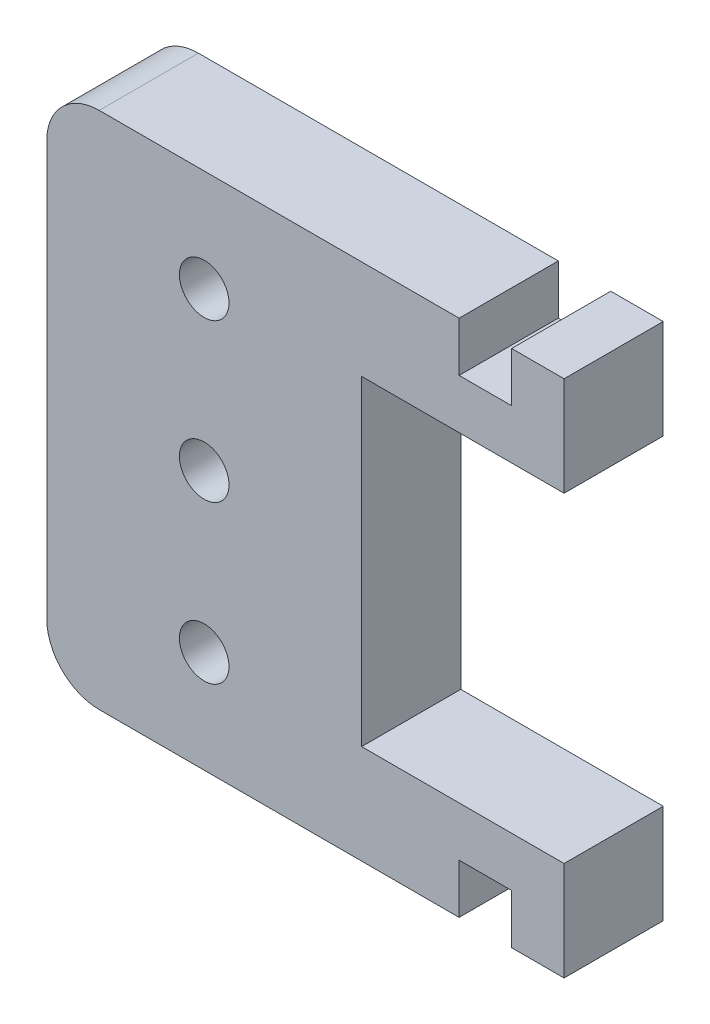
ISO-10303-21;
HEADER;
FILE_DESCRIPTION(('STEP AP214'),'2;1');
FILE_NAME('part.step','',(''),(''),'','','');
FILE_SCHEMA(('AUTOMOTIVE_DESIGN { 1 0 10303 214 1 1 1 1 }'));
ENDSEC;
DATA;
#1=APPLICATION_CONTEXT('core data for automotive mechanical design processes');
#2=APPLICATION_PROTOCOL_DEFINITION('international standard','automotive_design',2000,#1);
#3=PRODUCT_CONTEXT('',#1,'mechanical');
#4=PRODUCT('Part','Part','',(#3));
#5=PRODUCT_RELATED_PRODUCT_CATEGORY('part','',(#4));
#6=PRODUCT_DEFINITION_FORMATION('','',#4);
#7=PRODUCT_DEFINITION_CONTEXT('part definition',#1,'design');
#8=PRODUCT_DEFINITION('design','',#6,#7);
#9=PRODUCT_DEFINITION_SHAPE('','',#8);
#10=(LENGTH_UNIT() NAMED_UNIT(*) SI_UNIT(.MILLI.,.METRE.));
#11=(NAMED_UNIT(*) PLANE_ANGLE_UNIT() SI_UNIT($,.RADIAN.));
#12=(NAMED_UNIT(*) SI_UNIT($,.STERADIAN.) SOLID_ANGLE_UNIT());
#13=UNCERTAINTY_MEASURE_WITH_UNIT(LENGTH_MEASURE(1.E-05),#10,'distance_accuracy_value','');
#14=(GEOMETRIC_REPRESENTATION_CONTEXT(3) GLOBAL_UNCERTAINTY_ASSIGNED_CONTEXT((#13)) GLOBAL_UNIT_ASSIGNED_CONTEXT((#10,
#11,#12)) REPRESENTATION_CONTEXT('',''));
#15=CARTESIAN_POINT('',(0.,0.,0.));
#16=DIRECTION('',(0.,0.,1.));
#17=DIRECTION('',(1.,0.,0.));
#18=AXIS2_PLACEMENT_3D('',#15,#16,#17);
#19=CARTESIAN_POINT('',(0.,-15.699999969,3.));
#20=DIRECTION('',(0.,1.,0.));
#21=DIRECTION('',(0.,0.,1.));
#22=AXIS2_PLACEMENT_3D('',#19,#20,#21);
#23=PLANE('',#22);
#24=DIRECTION('',(1.,0.,0.));
#25=VECTOR('',#24,1.);
#26=CARTESIAN_POINT('',(0.,-15.699999969,3.));
#27=LINE('',#26,#25);
#28=CARTESIAN_POINT('',(-6.35000000000001,-15.699999969,3.));
#29=VERTEX_POINT('',#28);
#30=CARTESIAN_POINT('',(15.425,-15.699999969,3.));
#31=VERTEX_POINT('',#30);
#32=EDGE_CURVE('E174',#29,#31,#27,.T.);
#33=ORIENTED_EDGE('',*,*,#32,.F.);
#34=DIRECTION('',(0.,0.,-1.));
#35=VECTOR('',#34,1.);
#36=CARTESIAN_POINT('',(-6.35000000000001,-15.699999969,-3.));
#37=LINE('',#36,#35);
#38=CARTESIAN_POINT('',(-6.35000000000001,-15.699999969,-3.));
#39=VERTEX_POINT('',#38);
#40=EDGE_CURVE('E201',#29,#39,#37,.T.);
#41=ORIENTED_EDGE('',*,*,#40,.T.);
#42=DIRECTION('',(1.,0.,0.));
#43=VECTOR('',#42,1.);
#44=CARTESIAN_POINT('',(0.,-15.699999969,-3.));
#45=LINE('',#44,#43);
#46=CARTESIAN_POINT('',(15.425,-15.699999969,-3.));
#47=VERTEX_POINT('',#46);
#48=EDGE_CURVE('E198',#39,#47,#45,.T.);
#49=ORIENTED_EDGE('',*,*,#48,.T.);
#50=DIRECTION('',(0.,0.,-1.));
#51=VECTOR('',#50,1.);
#52=CARTESIAN_POINT('',(15.425,-15.699999969,3.));
#53=LINE('',#52,#51);
#54=EDGE_CURVE('E190',#31,#47,#53,.T.);
#55=ORIENTED_EDGE('',*,*,#54,.F.);
#56=EDGE_LOOP('',(#33,#41,#49,#55));
#57=FACE_BOUND('',#56,.T.);
#58=ADVANCED_FACE('F50',(#57),#23,.F.);
#59=CARTESIAN_POINT('',(15.425,0.,3.));
#60=DIRECTION('',(-1.,0.,0.));
#61=DIRECTION('',(0.,-1.,0.));
#62=AXIS2_PLACEMENT_3D('',#59,#60,#61);
#63=PLANE('',#62);
#64=DIRECTION('',(0.,1.,0.));
#65=VECTOR('',#64,1.);
#66=CARTESIAN_POINT('',(15.425,0.,-3.));
#67=LINE('',#66,#65);
#68=CARTESIAN_POINT('',(15.425,-12.699999969,-3.));
#69=VERTEX_POINT('',#68);
#70=EDGE_CURVE('E310',#47,#69,#67,.T.);
#71=ORIENTED_EDGE('',*,*,#70,.T.);
#72=DIRECTION('',(0.,0.,-1.));
#73=VECTOR('',#72,1.);
#74=CARTESIAN_POINT('',(15.425,-12.699999969,3.));
#75=LINE('',#74,#73);
#76=CARTESIAN_POINT('',(15.425,-12.699999969,3.));
#77=VERTEX_POINT('',#76);
#78=EDGE_CURVE('E192',#77,#69,#75,.T.);
#79=ORIENTED_EDGE('',*,*,#78,.F.);
#80=DIRECTION('',(0.,1.,0.));
#81=VECTOR('',#80,1.);
#82=CARTESIAN_POINT('',(15.425,0.,3.));
#83=LINE('',#82,#81);
#84=EDGE_CURVE('E177',#31,#77,#83,.T.);
#85=ORIENTED_EDGE('',*,*,#84,.F.);
#86=ORIENTED_EDGE('',*,*,#54,.T.);
#87=EDGE_LOOP('',(#71,#79,#85,#86));
#88=FACE_BOUND('',#87,.T.);
#89=ADVANCED_FACE('F189',(#88),#63,.F.);
#90=CARTESIAN_POINT('',(0.,-12.699999969,3.));
#91=DIRECTION('',(0.,1.,0.));
#92=DIRECTION('',(0.,0.,1.));
#93=AXIS2_PLACEMENT_3D('',#90,#91,#92);
#94=PLANE('',#93);
#95=DIRECTION('',(1.,0.,0.));
#96=VECTOR('',#95,1.);
#97=CARTESIAN_POINT('',(0.,-12.699999969,-3.));
#98=LINE('',#97,#96);
#99=CARTESIAN_POINT('',(18.6,-12.699999969,-3.));
#100=VERTEX_POINT('',#99);
#101=EDGE_CURVE('E313',#69,#100,#98,.T.);
#102=ORIENTED_EDGE('',*,*,#101,.T.);
#103=DIRECTION('',(0.,0.,-1.));
#104=VECTOR('',#103,1.);
#105=CARTESIAN_POINT('',(18.6,-12.699999969,3.));
#106=LINE('',#105,#104);
#107=CARTESIAN_POINT('',(18.6,-12.699999969,3.));
#108=VERTEX_POINT('',#107);
#109=EDGE_CURVE('E207',#108,#100,#106,.T.);
#110=ORIENTED_EDGE('',*,*,#109,.F.);
#111=DIRECTION('',(1.,0.,0.));
#112=VECTOR('',#111,1.);
#113=CARTESIAN_POINT('',(0.,-12.699999969,3.));
#114=LINE('',#113,#112);
#115=EDGE_CURVE('E195',#77,#108,#114,.T.);
#116=ORIENTED_EDGE('',*,*,#115,.F.);
#117=ORIENTED_EDGE('',*,*,#78,.T.);
#118=EDGE_LOOP('',(#102,#110,#116,#117));
#119=FACE_BOUND('',#118,.T.);
#120=ADVANCED_FACE('F502',(#119),#94,.F.);
#121=CARTESIAN_POINT('',(18.6,0.,3.));
#122=DIRECTION('',(1.,0.,0.));
#123=DIRECTION('',(0.,0.,-1.));
#124=AXIS2_PLACEMENT_3D('',#121,#122,#123);
#125=PLANE('',#124);
#126=DIRECTION('',(0.,-1.,0.));
#127=VECTOR('',#126,1.);
#128=CARTESIAN_POINT('',(18.6,0.,-3.));
#129=LINE('',#128,#127);
#130=CARTESIAN_POINT('',(18.6,-15.699999969,-3.));
#131=VERTEX_POINT('',#130);
#132=EDGE_CURVE('E316',#100,#131,#129,.T.);
#133=ORIENTED_EDGE('',*,*,#132,.T.);
#134=DIRECTION('',(0.,0.,-1.));
#135=VECTOR('',#134,1.);
#136=CARTESIAN_POINT('',(18.6,-15.699999969,3.));
#137=LINE('',#136,#135);
#138=CARTESIAN_POINT('',(18.6,-15.699999969,3.));
#139=VERTEX_POINT('',#138);
#140=EDGE_CURVE('E396',#139,#131,#137,.T.);
#141=ORIENTED_EDGE('',*,*,#140,.F.);
#142=DIRECTION('',(0.,-1.,0.));
#143=VECTOR('',#142,1.);
#144=CARTESIAN_POINT('',(18.6,0.,3.));
#145=LINE('',#144,#143);
#146=EDGE_CURVE('E243',#108,#139,#145,.T.);
#147=ORIENTED_EDGE('',*,*,#146,.F.);
#148=ORIENTED_EDGE('',*,*,#109,.T.);
#149=EDGE_LOOP('',(#133,#141,#147,#148));
#150=FACE_BOUND('',#149,.T.);
#151=ADVANCED_FACE('F404',(#150),#125,.F.);
#152=CARTESIAN_POINT('',(0.,-15.699999969,3.));
#153=DIRECTION('',(0.,-1.,0.));
#154=DIRECTION('',(0.,0.,-1.));
#155=AXIS2_PLACEMENT_3D('',#152,#153,#154);
#156=PLANE('',#155);
#157=DIRECTION('',(-1.,0.,0.));
#158=VECTOR('',#157,1.);
#159=CARTESIAN_POINT('',(0.,-15.699999969,-3.));
#160=LINE('',#159,#158);
#161=CARTESIAN_POINT('',(21.775,-15.699999969,-3.));
#162=VERTEX_POINT('',#161);
#163=EDGE_CURVE('E320',#162,#131,#160,.T.);
#164=ORIENTED_EDGE('',*,*,#163,.F.);
#165=DIRECTION('',(0.,0.,-1.));
#166=VECTOR('',#165,1.);
#167=CARTESIAN_POINT('',(21.775,-15.699999969,3.));
#168=LINE('',#167,#166);
#169=CARTESIAN_POINT('',(21.775,-15.699999969,3.));
#170=VERTEX_POINT('',#169);
#171=EDGE_CURVE('E393',#170,#162,#168,.T.);
#172=ORIENTED_EDGE('',*,*,#171,.F.);
#173=DIRECTION('',(-1.,0.,0.));
#174=VECTOR('',#173,1.);
#175=CARTESIAN_POINT('',(0.,-15.699999969,3.));
#176=LINE('',#175,#174);
#177=EDGE_CURVE('E251',#170,#139,#176,.T.);
#178=ORIENTED_EDGE('',*,*,#177,.T.);
#179=ORIENTED_EDGE('',*,*,#140,.T.);
#180=EDGE_LOOP('',(#164,#172,#178,#179));
#181=FACE_BOUND('',#180,.T.);
#182=ADVANCED_FACE('F414',(#181),#156,.T.);
#183=CARTESIAN_POINT('',(21.775,0.,3.));
#184=DIRECTION('',(1.,0.,0.));
#185=DIRECTION('',(0.,1.,0.));
#186=AXIS2_PLACEMENT_3D('',#183,#184,#185);
#187=PLANE('',#186);
#188=DIRECTION('',(0.,-1.,0.));
#189=VECTOR('',#188,1.);
#190=CARTESIAN_POINT('',(21.775,0.,-3.));
#191=LINE('',#190,#189);
#192=CARTESIAN_POINT('',(21.775,-9.699999969,-3.));
#193=VERTEX_POINT('',#192);
#194=EDGE_CURVE('E324',#193,#162,#191,.T.);
#195=ORIENTED_EDGE('',*,*,#194,.F.);
#196=DIRECTION('',(0.,0.,-1.));
#197=VECTOR('',#196,1.);
#198=CARTESIAN_POINT('',(21.775,-9.699999969,3.));
#199=LINE('',#198,#197);
#200=CARTESIAN_POINT('',(21.775,-9.699999969,3.));
#201=VERTEX_POINT('',#200);
#202=EDGE_CURVE('E390',#201,#193,#199,.T.);
#203=ORIENTED_EDGE('',*,*,#202,.F.);
#204=DIRECTION('',(0.,-1.,0.));
#205=VECTOR('',#204,1.);
#206=CARTESIAN_POINT('',(21.775,0.,3.));
#207=LINE('',#206,#205);
#208=EDGE_CURVE('E255',#201,#170,#207,.T.);
#209=ORIENTED_EDGE('',*,*,#208,.T.);
#210=ORIENTED_EDGE('',*,*,#171,.T.);
#211=EDGE_LOOP('',(#195,#203,#209,#210));
#212=FACE_BOUND('',#211,.T.);
#213=ADVANCED_FACE('F418',(#212),#187,.T.);
#214=CARTESIAN_POINT('',(0.,-9.699999969,3.));
#215=DIRECTION('',(0.,-1.,0.));
#216=DIRECTION('',(1.,0.,0.));
#217=AXIS2_PLACEMENT_3D('',#214,#215,#216);
#218=PLANE('',#217);
#219=DIRECTION('',(-1.,0.,0.));
#220=VECTOR('',#219,1.);
#221=CARTESIAN_POINT('',(0.,-9.699999969,-3.));
#222=LINE('',#221,#220);
#223=CARTESIAN_POINT('',(9.525,-9.699999969,-3.));
#224=VERTEX_POINT('',#223);
#225=EDGE_CURVE('E328',#193,#224,#222,.T.);
#226=ORIENTED_EDGE('',*,*,#225,.T.);
#227=DIRECTION('',(0.,0.,-1.));
#228=VECTOR('',#227,1.);
#229=CARTESIAN_POINT('',(9.525,-9.699999969,3.));
#230=LINE('',#229,#228);
#231=CARTESIAN_POINT('',(9.525,-9.699999969,3.));
#232=VERTEX_POINT('',#231);
#233=EDGE_CURVE('E386',#232,#224,#230,.T.);
#234=ORIENTED_EDGE('',*,*,#233,.F.);
#235=DIRECTION('',(-1.,0.,0.));
#236=VECTOR('',#235,1.);
#237=CARTESIAN_POINT('',(0.,-9.699999969,3.));
#238=LINE('',#237,#236);
#239=EDGE_CURVE('E260',#201,#232,#238,.T.);
#240=ORIENTED_EDGE('',*,*,#239,.F.);
#241=ORIENTED_EDGE('',*,*,#202,.T.);
#242=EDGE_LOOP('',(#226,#234,#240,#241));
#243=FACE_BOUND('',#242,.T.);
#244=ADVANCED_FACE('F422',(#243),#218,.F.);
#245=CARTESIAN_POINT('',(9.525,0.,3.));
#246=DIRECTION('',(-1.,0.,0.));
#247=DIRECTION('',(0.,0.,1.));
#248=AXIS2_PLACEMENT_3D('',#245,#246,#247);
#249=PLANE('',#248);
#250=DIRECTION('',(0.,1.,0.));
#251=VECTOR('',#250,1.);
#252=CARTESIAN_POINT('',(9.525,0.,-3.));
#253=LINE('',#252,#251);
#254=CARTESIAN_POINT('',(9.525,9.69999996899999,-3.));
#255=VERTEX_POINT('',#254);
#256=EDGE_CURVE('E331',#224,#255,#253,.T.);
#257=ORIENTED_EDGE('',*,*,#256,.T.);
#258=DIRECTION('',(0.,0.,-1.));
#259=VECTOR('',#258,1.);
#260=CARTESIAN_POINT('',(9.525,9.69999996899999,3.));
#261=LINE('',#260,#259);
#262=CARTESIAN_POINT('',(9.525,9.69999996899999,3.));
#263=VERTEX_POINT('',#262);
#264=EDGE_CURVE('E383',#263,#255,#261,.T.);
#265=ORIENTED_EDGE('',*,*,#264,.F.);
#266=DIRECTION('',(0.,1.,0.));
#267=VECTOR('',#266,1.);
#268=CARTESIAN_POINT('',(9.525,0.,3.));
#269=LINE('',#268,#267);
#270=EDGE_CURVE('E264',#232,#263,#269,.T.);
#271=ORIENTED_EDGE('',*,*,#270,.F.);
#272=ORIENTED_EDGE('',*,*,#233,.T.);
#273=EDGE_LOOP('',(#257,#265,#271,#272));
#274=FACE_BOUND('',#273,.T.);
#275=ADVANCED_FACE('F428',(#274),#249,.F.);
#276=CARTESIAN_POINT('',(0.,9.69999996899999,3.));
#277=DIRECTION('',(0.,-1.,0.));
#278=DIRECTION('',(1.,0.,0.));
#279=AXIS2_PLACEMENT_3D('',#276,#277,#278);
#280=PLANE('',#279);
#281=DIRECTION('',(-1.,0.,0.));
#282=VECTOR('',#281,1.);
#283=CARTESIAN_POINT('',(0.,9.69999996899999,-3.));
#284=LINE('',#283,#282);
#285=CARTESIAN_POINT('',(21.775,9.69999996899999,-3.));
#286=VERTEX_POINT('',#285);
#287=EDGE_CURVE('E335',#286,#255,#284,.T.);
#288=ORIENTED_EDGE('',*,*,#287,.F.);
#289=DIRECTION('',(0.,0.,-1.));
#290=VECTOR('',#289,1.);
#291=CARTESIAN_POINT('',(21.775,9.69999996899999,3.));
#292=LINE('',#291,#290);
#293=CARTESIAN_POINT('',(21.775,9.69999996899999,3.));
#294=VERTEX_POINT('',#293);
#295=EDGE_CURVE('E380',#294,#286,#292,.T.);
#296=ORIENTED_EDGE('',*,*,#295,.F.);
#297=DIRECTION('',(-1.,0.,0.));
#298=VECTOR('',#297,1.);
#299=CARTESIAN_POINT('',(0.,9.69999996899999,3.));
#300=LINE('',#299,#298);
#301=EDGE_CURVE('E272',#294,#263,#300,.T.);
#302=ORIENTED_EDGE('',*,*,#301,.T.);
#303=ORIENTED_EDGE('',*,*,#264,.T.);
#304=EDGE_LOOP('',(#288,#296,#302,#303));
#305=FACE_BOUND('',#304,.T.);
#306=ADVANCED_FACE('F432',(#305),#280,.T.);
#307=CARTESIAN_POINT('',(21.775,0.,3.));
#308=DIRECTION('',(-1.,0.,0.));
#309=DIRECTION('',(0.,-1.,0.));
#310=AXIS2_PLACEMENT_3D('',#307,#308,#309);
#311=PLANE('',#310);
#312=DIRECTION('',(0.,1.,0.));
#313=VECTOR('',#312,1.);
#314=CARTESIAN_POINT('',(21.775,0.,-3.));
#315=LINE('',#314,#313);
#316=CARTESIAN_POINT('',(21.775,15.699999969,-3.));
#317=VERTEX_POINT('',#316);
#318=EDGE_CURVE('E339',#286,#317,#315,.T.);
#319=ORIENTED_EDGE('',*,*,#318,.T.);
#320=DIRECTION('',(0.,0.,-1.));
#321=VECTOR('',#320,1.);
#322=CARTESIAN_POINT('',(21.775,15.699999969,3.));
#323=LINE('',#322,#321);
#324=CARTESIAN_POINT('',(21.775,15.699999969,3.));
#325=VERTEX_POINT('',#324);
#326=EDGE_CURVE('E376',#325,#317,#323,.T.);
#327=ORIENTED_EDGE('',*,*,#326,.F.);
#328=DIRECTION('',(0.,1.,0.));
#329=VECTOR('',#328,1.);
#330=CARTESIAN_POINT('',(21.775,0.,3.));
#331=LINE('',#330,#329);
#332=EDGE_CURVE('E276',#294,#325,#331,.T.);
#333=ORIENTED_EDGE('',*,*,#332,.F.);
#334=ORIENTED_EDGE('',*,*,#295,.T.);
#335=EDGE_LOOP('',(#319,#327,#333,#334));
#336=FACE_BOUND('',#335,.T.);
#337=ADVANCED_FACE('F437',(#336),#311,.F.);
#338=CARTESIAN_POINT('',(0.,15.699999969,3.));
#339=DIRECTION('',(0.,-1.,0.));
#340=DIRECTION('',(0.,0.,-1.));
#341=AXIS2_PLACEMENT_3D('',#338,#339,#340);
#342=PLANE('',#341);
#343=DIRECTION('',(-1.,0.,0.));
#344=VECTOR('',#343,1.);
#345=CARTESIAN_POINT('',(0.,15.699999969,-3.));
#346=LINE('',#345,#344);
#347=CARTESIAN_POINT('',(18.6,15.699999969,-3.));
#348=VERTEX_POINT('',#347);
#349=EDGE_CURVE('E342',#317,#348,#346,.T.);
#350=ORIENTED_EDGE('',*,*,#349,.T.);
#351=DIRECTION('',(0.,0.,-1.));
#352=VECTOR('',#351,1.);
#353=CARTESIAN_POINT('',(18.6,15.699999969,3.));
#354=LINE('',#353,#352);
#355=CARTESIAN_POINT('',(18.6,15.699999969,3.));
#356=VERTEX_POINT('',#355);
#357=EDGE_CURVE('E373',#356,#348,#354,.T.);
#358=ORIENTED_EDGE('',*,*,#357,.F.);
#359=DIRECTION('',(-1.,0.,0.));
#360=VECTOR('',#359,1.);
#361=CARTESIAN_POINT('',(0.,15.699999969,3.));
#362=LINE('',#361,#360);
#363=EDGE_CURVE('E280',#325,#356,#362,.T.);
#364=ORIENTED_EDGE('',*,*,#363,.F.);
#365=ORIENTED_EDGE('',*,*,#326,.T.);
#366=EDGE_LOOP('',(#350,#358,#364,#365));
#367=FACE_BOUND('',#366,.T.);
#368=ADVANCED_FACE('F444',(#367),#342,.F.);
#369=CARTESIAN_POINT('',(18.6,0.,3.));
#370=DIRECTION('',(-1.,0.,0.));
#371=DIRECTION('',(0.,0.,1.));
#372=AXIS2_PLACEMENT_3D('',#369,#370,#371);
#373=PLANE('',#372);
#374=DIRECTION('',(0.,1.,0.));
#375=VECTOR('',#374,1.);
#376=CARTESIAN_POINT('',(18.6,0.,-3.));
#377=LINE('',#376,#375);
#378=CARTESIAN_POINT('',(18.6,12.699999969,-3.));
#379=VERTEX_POINT('',#378);
#380=EDGE_CURVE('E346',#379,#348,#377,.T.);
#381=ORIENTED_EDGE('',*,*,#380,.F.);
#382=DIRECTION('',(0.,0.,-1.));
#383=VECTOR('',#382,1.);
#384=CARTESIAN_POINT('',(18.6,12.699999969,3.));
#385=LINE('',#384,#383);
#386=CARTESIAN_POINT('',(18.6,12.699999969,3.));
#387=VERTEX_POINT('',#386);
#388=EDGE_CURVE('E370',#387,#379,#385,.T.);
#389=ORIENTED_EDGE('',*,*,#388,.F.);
#390=DIRECTION('',(0.,1.,0.));
#391=VECTOR('',#390,1.);
#392=CARTESIAN_POINT('',(18.6,0.,3.));
#393=LINE('',#392,#391);
#394=EDGE_CURVE('E284',#387,#356,#393,.T.);
#395=ORIENTED_EDGE('',*,*,#394,.T.);
#396=ORIENTED_EDGE('',*,*,#357,.T.);
#397=EDGE_LOOP('',(#381,#389,#395,#396));
#398=FACE_BOUND('',#397,.T.);
#399=ADVANCED_FACE('F448',(#398),#373,.T.);
#400=CARTESIAN_POINT('',(0.,12.699999969,3.));
#401=DIRECTION('',(0.,1.,0.));
#402=DIRECTION('',(-1.,0.,0.));
#403=AXIS2_PLACEMENT_3D('',#400,#401,#402);
#404=PLANE('',#403);
#405=DIRECTION('',(1.,0.,0.));
#406=VECTOR('',#405,1.);
#407=CARTESIAN_POINT('',(0.,12.699999969,-3.));
#408=LINE('',#407,#406);
#409=CARTESIAN_POINT('',(15.425,12.699999969,-3.));
#410=VERTEX_POINT('',#409);
#411=EDGE_CURVE('E350',#410,#379,#408,.T.);
#412=ORIENTED_EDGE('',*,*,#411,.F.);
#413=DIRECTION('',(0.,0.,-1.));
#414=VECTOR('',#413,1.);
#415=CARTESIAN_POINT('',(15.425,12.699999969,3.));
#416=LINE('',#415,#414);
#417=CARTESIAN_POINT('',(15.425,12.699999969,3.));
#418=VERTEX_POINT('',#417);
#419=EDGE_CURVE('E367',#418,#410,#416,.T.);
#420=ORIENTED_EDGE('',*,*,#419,.F.);
#421=DIRECTION('',(1.,0.,0.));
#422=VECTOR('',#421,1.);
#423=CARTESIAN_POINT('',(0.,12.699999969,3.));
#424=LINE('',#423,#422);
#425=EDGE_CURVE('E291',#418,#387,#424,.T.);
#426=ORIENTED_EDGE('',*,*,#425,.T.);
#427=ORIENTED_EDGE('',*,*,#388,.T.);
#428=EDGE_LOOP('',(#412,#420,#426,#427));
#429=FACE_BOUND('',#428,.T.);
#430=ADVANCED_FACE('F536',(#429),#404,.T.);
#431=CARTESIAN_POINT('',(15.425,0.,3.));
#432=DIRECTION('',(1.,0.,0.));
#433=DIRECTION('',(0.,1.,0.));
#434=AXIS2_PLACEMENT_3D('',#431,#432,#433);
#435=PLANE('',#434);
#436=DIRECTION('',(0.,-1.,0.));
#437=VECTOR('',#436,1.);
#438=CARTESIAN_POINT('',(15.425,0.,-3.));
#439=LINE('',#438,#437);
#440=CARTESIAN_POINT('',(15.425,15.699999969,-3.));
#441=VERTEX_POINT('',#440);
#442=EDGE_CURVE('E354',#441,#410,#439,.T.);
#443=ORIENTED_EDGE('',*,*,#442,.F.);
#444=DIRECTION('',(0.,0.,-1.));
#445=VECTOR('',#444,1.);
#446=CARTESIAN_POINT('',(15.425,15.699999969,3.));
#447=LINE('',#446,#445);
#448=CARTESIAN_POINT('',(15.425,15.699999969,3.));
#449=VERTEX_POINT('',#448);
#450=EDGE_CURVE('E307',#449,#441,#447,.T.);
#451=ORIENTED_EDGE('',*,*,#450,.F.);
#452=DIRECTION('',(0.,-1.,0.));
#453=VECTOR('',#452,1.);
#454=CARTESIAN_POINT('',(15.425,0.,3.));
#455=LINE('',#454,#453);
#456=EDGE_CURVE('E295',#449,#418,#455,.T.);
#457=ORIENTED_EDGE('',*,*,#456,.T.);
#458=ORIENTED_EDGE('',*,*,#419,.T.);
#459=EDGE_LOOP('',(#443,#451,#457,#458));
#460=FACE_BOUND('',#459,.T.);
#461=ADVANCED_FACE('F539',(#460),#435,.T.);
#462=CARTESIAN_POINT('',(0.,15.699999969,3.));
#463=DIRECTION('',(0.,1.,0.));
#464=DIRECTION('',(0.,0.,1.));
#465=AXIS2_PLACEMENT_3D('',#462,#463,#464);
#466=PLANE('',#465);
#467=DIRECTION('',(1.,0.,0.));
#468=VECTOR('',#467,1.);
#469=CARTESIAN_POINT('',(0.,15.699999969,-3.));
#470=LINE('',#469,#468);
#471=CARTESIAN_POINT('',(-6.35000000000001,15.699999969,-3.));
#472=VERTEX_POINT('',#471);
#473=EDGE_CURVE('E358',#472,#441,#470,.T.);
#474=ORIENTED_EDGE('',*,*,#473,.F.);
#475=DIRECTION('',(0.,0.,-1.));
#476=VECTOR('',#475,1.);
#477=CARTESIAN_POINT('',(-6.35000000000001,15.699999969,3.));
#478=LINE('',#477,#476);
#479=CARTESIAN_POINT('',(-6.35000000000001,15.699999969,3.));
#480=VERTEX_POINT('',#479);
#481=EDGE_CURVE('E12',#472,#480,#478,.F.);
#482=ORIENTED_EDGE('',*,*,#481,.T.);
#483=DIRECTION('',(1.,0.,0.));
#484=VECTOR('',#483,1.);
#485=CARTESIAN_POINT('',(0.,15.699999969,3.));
#486=LINE('',#485,#484);
#487=EDGE_CURVE('E300',#480,#449,#486,.T.);
#488=ORIENTED_EDGE('',*,*,#487,.T.);
#489=ORIENTED_EDGE('',*,*,#450,.T.);
#490=EDGE_LOOP('',(#474,#482,#488,#489));
#491=FACE_BOUND('',#490,.T.);
#492=ADVANCED_FACE('F542',(#491),#466,.T.);
#493=CARTESIAN_POINT('',(-9.52500000000001,0.,3.));
#494=DIRECTION('',(-1.,0.,0.));
#495=DIRECTION('',(0.,0.,1.));
#496=AXIS2_PLACEMENT_3D('',#493,#494,#495);
#497=PLANE('',#496);
#498=DIRECTION('',(0.,1.,0.));
#499=VECTOR('',#498,1.);
#500=CARTESIAN_POINT('',(-9.52500000000001,0.,-3.));
#501=LINE('',#500,#499);
#502=CARTESIAN_POINT('',(-9.52500000000001,-12.524999969,-3.));
#503=VERTEX_POINT('',#502);
#504=CARTESIAN_POINT('',(-9.52500000000001,12.524999969,-3.));
#505=VERTEX_POINT('',#504);
#506=EDGE_CURVE('E185',#503,#505,#501,.T.);
#507=ORIENTED_EDGE('',*,*,#506,.F.);
#508=DIRECTION('',(0.,0.,-1.));
#509=VECTOR('',#508,1.);
#510=CARTESIAN_POINT('',(-9.52500000000001,-12.524999969,3.));
#511=LINE('',#510,#509);
#512=CARTESIAN_POINT('',(-9.52500000000001,-12.524999969,3.));
#513=VERTEX_POINT('',#512);
#514=EDGE_CURVE('E220',#503,#513,#511,.F.);
#515=ORIENTED_EDGE('',*,*,#514,.T.);
#516=DIRECTION('',(0.,1.,0.));
#517=VECTOR('',#516,1.);
#518=CARTESIAN_POINT('',(-9.52500000000001,0.,3.));
#519=LINE('',#518,#517);
#520=CARTESIAN_POINT('',(-9.52500000000001,12.524999969,3.));
#521=VERTEX_POINT('',#520);
#522=EDGE_CURVE('E303',#513,#521,#519,.T.);
#523=ORIENTED_EDGE('',*,*,#522,.T.);
#524=DIRECTION('',(0.,0.,-1.));
#525=VECTOR('',#524,1.);
#526=CARTESIAN_POINT('',(-9.52500000000001,12.524999969,3.));
#527=LINE('',#526,#525);
#528=EDGE_CURVE('E216',#521,#505,#527,.T.);
#529=ORIENTED_EDGE('',*,*,#528,.T.);
#530=EDGE_LOOP('',(#507,#515,#523,#529));
#531=FACE_BOUND('',#530,.T.);
#532=ADVANCED_FACE('F545',(#531),#497,.T.);
#533=CARTESIAN_POINT('',(0.,0.,3.));
#534=DIRECTION('',(0.,0.,1.));
#535=DIRECTION('',(1.,0.,0.));
#536=AXIS2_PLACEMENT_3D('',#533,#534,#535);
#537=PLANE('',#536);
#538=CARTESIAN_POINT('',(0.,9.525,3.));
#539=DIRECTION('',(0.,0.,1.));
#540=DIRECTION('',(1.,0.,0.));
#541=AXIS2_PLACEMENT_3D('',#538,#539,#540);
#542=CIRCLE('',#541,1.5);
#543=CARTESIAN_POINT('',(1.5,9.525,3.));
#544=VERTEX_POINT('',#543);
#545=EDGE_CURVE('E235',#544,#544,#542,.T.);
#546=ORIENTED_EDGE('',*,*,#545,.F.);
#547=EDGE_LOOP('',(#546));
#548=FACE_BOUND('',#547,.T.);
#549=CARTESIAN_POINT('',(0.,-9.525,3.));
#550=DIRECTION('',(0.,0.,1.));
#551=DIRECTION('',(1.,0.,0.));
#552=AXIS2_PLACEMENT_3D('',#549,#550,#551);
#553=CIRCLE('',#552,1.5);
#554=CARTESIAN_POINT('',(1.5,-9.525,3.));
#555=VERTEX_POINT('',#554);
#556=EDGE_CURVE('E454',#555,#555,#553,.T.);
#557=ORIENTED_EDGE('',*,*,#556,.F.);
#558=EDGE_LOOP('',(#557));
#559=FACE_BOUND('',#558,.T.);
#560=CARTESIAN_POINT('',(0.,0.,3.));
#561=DIRECTION('',(0.,0.,1.));
#562=DIRECTION('',(1.,0.,0.));
#563=AXIS2_PLACEMENT_3D('',#560,#561,#562);
#564=CIRCLE('',#563,1.5);
#565=CARTESIAN_POINT('',(1.5,0.,3.));
#566=VERTEX_POINT('',#565);
#567=EDGE_CURVE('E457',#566,#566,#564,.T.);
#568=ORIENTED_EDGE('',*,*,#567,.F.);
#569=EDGE_LOOP('',(#568));
#570=FACE_BOUND('',#569,.T.);
#571=ORIENTED_EDGE('',*,*,#522,.F.);
#572=CARTESIAN_POINT('',(-6.35000000000001,-12.524999969,3.));
#573=DIRECTION('',(0.,0.,1.));
#574=DIRECTION('',(1.,0.,0.));
#575=AXIS2_PLACEMENT_3D('',#572,#573,#574);
#576=CIRCLE('',#575,3.175);
#577=EDGE_CURVE('E59',#513,#29,#576,.T.);
#578=ORIENTED_EDGE('',*,*,#577,.T.);
#579=ORIENTED_EDGE('',*,*,#32,.T.);
#580=ORIENTED_EDGE('',*,*,#84,.T.);
#581=ORIENTED_EDGE('',*,*,#115,.T.);
#582=ORIENTED_EDGE('',*,*,#146,.T.);
#583=ORIENTED_EDGE('',*,*,#177,.F.);
#584=ORIENTED_EDGE('',*,*,#208,.F.);
#585=ORIENTED_EDGE('',*,*,#239,.T.);
#586=ORIENTED_EDGE('',*,*,#270,.T.);
#587=ORIENTED_EDGE('',*,*,#301,.F.);
#588=ORIENTED_EDGE('',*,*,#332,.T.);
#589=ORIENTED_EDGE('',*,*,#363,.T.);
#590=ORIENTED_EDGE('',*,*,#394,.F.);
#591=ORIENTED_EDGE('',*,*,#425,.F.);
#592=ORIENTED_EDGE('',*,*,#456,.F.);
#593=ORIENTED_EDGE('',*,*,#487,.F.);
#594=CARTESIAN_POINT('',(-6.35000000000001,12.524999969,3.));
#595=DIRECTION('',(0.,0.,1.));
#596=DIRECTION('',(1.,0.,0.));
#597=AXIS2_PLACEMENT_3D('',#594,#595,#596);
#598=CIRCLE('',#597,3.175);
#599=EDGE_CURVE('E71',#480,#521,#598,.T.);
#600=ORIENTED_EDGE('',*,*,#599,.T.);
#601=EDGE_LOOP('',(#571,#578,#579,#580,#581,#582,#583,#584,#585,#586,#587,#588,#589,#590,#591,
#592,#593,#600));
#602=FACE_BOUND('',#601,.T.);
#603=ADVANCED_FACE('F176',(#548,#559,#570,#602),#537,.T.);
#604=CARTESIAN_POINT('',(0.,0.,-3.));
#605=DIRECTION('',(0.,0.,1.));
#606=DIRECTION('',(1.,0.,0.));
#607=AXIS2_PLACEMENT_3D('',#604,#605,#606);
#608=PLANE('',#607);
#609=CARTESIAN_POINT('',(0.,9.525,-3.));
#610=DIRECTION('',(0.,0.,1.));
#611=DIRECTION('',(1.,0.,0.));
#612=AXIS2_PLACEMENT_3D('',#609,#610,#611);
#613=CIRCLE('',#612,1.5);
#614=CARTESIAN_POINT('',(1.5,9.525,-3.));
#615=VERTEX_POINT('',#614);
#616=EDGE_CURVE('E460',#615,#615,#613,.T.);
#617=ORIENTED_EDGE('',*,*,#616,.T.);
#618=EDGE_LOOP('',(#617));
#619=FACE_BOUND('',#618,.T.);
#620=CARTESIAN_POINT('',(0.,-9.525,-3.));
#621=DIRECTION('',(0.,0.,1.));
#622=DIRECTION('',(1.,0.,0.));
#623=AXIS2_PLACEMENT_3D('',#620,#621,#622);
#624=CIRCLE('',#623,1.5);
#625=CARTESIAN_POINT('',(1.5,-9.525,-3.));
#626=VERTEX_POINT('',#625);
#627=EDGE_CURVE('E464',#626,#626,#624,.T.);
#628=ORIENTED_EDGE('',*,*,#627,.T.);
#629=EDGE_LOOP('',(#628));
#630=FACE_BOUND('',#629,.T.);
#631=CARTESIAN_POINT('',(0.,0.,-3.));
#632=DIRECTION('',(0.,0.,1.));
#633=DIRECTION('',(1.,0.,0.));
#634=AXIS2_PLACEMENT_3D('',#631,#632,#633);
#635=CIRCLE('',#634,1.5);
#636=CARTESIAN_POINT('',(1.5,0.,-3.));
#637=VERTEX_POINT('',#636);
#638=EDGE_CURVE('E468',#637,#637,#635,.T.);
#639=ORIENTED_EDGE('',*,*,#638,.T.);
#640=EDGE_LOOP('',(#639));
#641=FACE_BOUND('',#640,.T.);
#642=ORIENTED_EDGE('',*,*,#48,.F.);
#643=CARTESIAN_POINT('',(-6.35000000000001,-12.524999969,-3.));
#644=DIRECTION('',(0.,0.,1.));
#645=DIRECTION('',(1.,0.,0.));
#646=AXIS2_PLACEMENT_3D('',#643,#644,#645);
#647=CIRCLE('',#646,3.175);
#648=EDGE_CURVE('E213',#39,#503,#647,.F.);
#649=ORIENTED_EDGE('',*,*,#648,.T.);
#650=ORIENTED_EDGE('',*,*,#506,.T.);
#651=CARTESIAN_POINT('',(-6.35000000000001,12.524999969,-3.));
#652=DIRECTION('',(0.,0.,1.));
#653=DIRECTION('',(1.,0.,0.));
#654=AXIS2_PLACEMENT_3D('',#651,#652,#653);
#655=CIRCLE('',#654,3.175);
#656=EDGE_CURVE('E205',#505,#472,#655,.F.);
#657=ORIENTED_EDGE('',*,*,#656,.T.);
#658=ORIENTED_EDGE('',*,*,#473,.T.);
#659=ORIENTED_EDGE('',*,*,#442,.T.);
#660=ORIENTED_EDGE('',*,*,#411,.T.);
#661=ORIENTED_EDGE('',*,*,#380,.T.);
#662=ORIENTED_EDGE('',*,*,#349,.F.);
#663=ORIENTED_EDGE('',*,*,#318,.F.);
#664=ORIENTED_EDGE('',*,*,#287,.T.);
#665=ORIENTED_EDGE('',*,*,#256,.F.);
#666=ORIENTED_EDGE('',*,*,#225,.F.);
#667=ORIENTED_EDGE('',*,*,#194,.T.);
#668=ORIENTED_EDGE('',*,*,#163,.T.);
#669=ORIENTED_EDGE('',*,*,#132,.F.);
#670=ORIENTED_EDGE('',*,*,#101,.F.);
#671=ORIENTED_EDGE('',*,*,#70,.F.);
#672=EDGE_LOOP('',(#642,#649,#650,#657,#658,#659,#660,#661,#662,#663,#664,#665,#666,#667,#668,
#669,#670,#671));
#673=FACE_BOUND('',#672,.T.);
#674=ADVANCED_FACE('F409',(#619,#630,#641,#673),#608,.F.);
#675=CARTESIAN_POINT('',(-6.35000000000001,-12.524999969,3.));
#676=DIRECTION('',(0.,0.,1.));
#677=DIRECTION('',(1.,0.,0.));
#678=AXIS2_PLACEMENT_3D('',#675,#676,#677);
#679=CYLINDRICAL_SURFACE('',#678,3.175);
#680=ORIENTED_EDGE('',*,*,#577,.F.);
#681=ORIENTED_EDGE('',*,*,#514,.F.);
#682=ORIENTED_EDGE('',*,*,#648,.F.);
#683=ORIENTED_EDGE('',*,*,#40,.F.);
#684=EDGE_LOOP('',(#680,#681,#682,#683));
#685=FACE_BOUND('',#684,.T.);
#686=ADVANCED_FACE('F492',(#685),#679,.T.);
#687=CARTESIAN_POINT('',(-6.35000000000001,12.524999969,3.));
#688=DIRECTION('',(0.,0.,-1.));
#689=DIRECTION('',(-1.,0.,0.));
#690=AXIS2_PLACEMENT_3D('',#687,#688,#689);
#691=CYLINDRICAL_SURFACE('',#690,3.175);
#692=ORIENTED_EDGE('',*,*,#599,.F.);
#693=ORIENTED_EDGE('',*,*,#481,.F.);
#694=ORIENTED_EDGE('',*,*,#656,.F.);
#695=ORIENTED_EDGE('',*,*,#528,.F.);
#696=EDGE_LOOP('',(#692,#693,#694,#695));
#697=FACE_BOUND('',#696,.T.);
#698=ADVANCED_FACE('F52',(#697),#691,.T.);
#699=CARTESIAN_POINT('',(0.,0.,-3.));
#700=DIRECTION('',(0.,0.,1.));
#701=DIRECTION('',(1.,0.,0.));
#702=AXIS2_PLACEMENT_3D('',#699,#700,#701);
#703=CYLINDRICAL_SURFACE('',#702,1.5);
#704=ORIENTED_EDGE('',*,*,#567,.T.);
#705=EDGE_LOOP('',(#704));
#706=FACE_BOUND('',#705,.T.);
#707=ORIENTED_EDGE('',*,*,#638,.F.);
#708=EDGE_LOOP('',(#707));
#709=FACE_BOUND('',#708,.T.);
#710=ADVANCED_FACE('F479',(#706,#709),#703,.F.);
#711=CARTESIAN_POINT('',(0.,-9.525,-3.));
#712=DIRECTION('',(0.,0.,1.));
#713=DIRECTION('',(1.,0.,0.));
#714=AXIS2_PLACEMENT_3D('',#711,#712,#713);
#715=CYLINDRICAL_SURFACE('',#714,1.5);
#716=ORIENTED_EDGE('',*,*,#556,.T.);
#717=EDGE_LOOP('',(#716));
#718=FACE_BOUND('',#717,.T.);
#719=ORIENTED_EDGE('',*,*,#627,.F.);
#720=EDGE_LOOP('',(#719));
#721=FACE_BOUND('',#720,.T.);
#722=ADVANCED_FACE('F481',(#718,#721),#715,.F.);
#723=CARTESIAN_POINT('',(0.,9.525,-3.));
#724=DIRECTION('',(0.,0.,1.));
#725=DIRECTION('',(1.,0.,0.));
#726=AXIS2_PLACEMENT_3D('',#723,#724,#725);
#727=CYLINDRICAL_SURFACE('',#726,1.5);
#728=ORIENTED_EDGE('',*,*,#545,.T.);
#729=EDGE_LOOP('',(#728));
#730=FACE_BOUND('',#729,.T.);
#731=ORIENTED_EDGE('',*,*,#616,.F.);
#732=EDGE_LOOP('',(#731));
#733=FACE_BOUND('',#732,.T.);
#734=ADVANCED_FACE('F488',(#730,#733),#727,.F.);
#735=CLOSED_SHELL('',(#58,#89,#120,#151,#182,#213,#244,#275,#306,#337,#368,#399,#430,#461,#492,
#532,#603,#674,#686,#698,#710,#722,#734));
#736=MANIFOLD_SOLID_BREP('B2',#735);
#737=ADVANCED_BREP_SHAPE_REPRESENTATION('',(#18,#736),#14);
#738=SHAPE_DEFINITION_REPRESENTATION(#9,#737);
ENDSEC;
END-ISO-10303-21;
